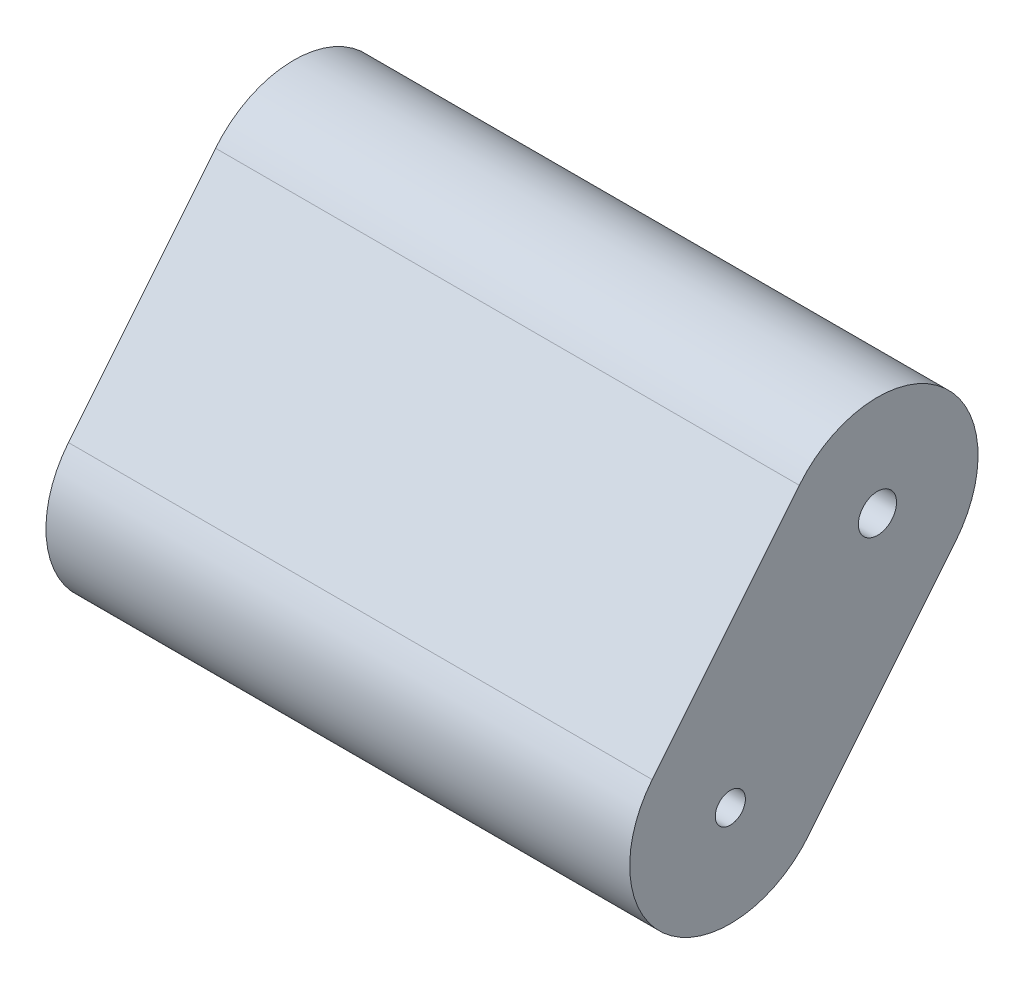
ISO-10303-21;
HEADER;
FILE_DESCRIPTION(('STEP AP214'),'2;1');
FILE_NAME('part.step','',(''),(''),'','','');
FILE_SCHEMA(('AUTOMOTIVE_DESIGN { 1 0 10303 214 1 1 1 1 }'));
ENDSEC;
DATA;
#1=APPLICATION_CONTEXT('core data for automotive mechanical design processes');
#2=APPLICATION_PROTOCOL_DEFINITION('international standard','automotive_design',2000,#1);
#3=PRODUCT_CONTEXT('',#1,'mechanical');
#4=PRODUCT('Part','Part','',(#3));
#5=PRODUCT_RELATED_PRODUCT_CATEGORY('part','',(#4));
#6=PRODUCT_DEFINITION_FORMATION('','',#4);
#7=PRODUCT_DEFINITION_CONTEXT('part definition',#1,'design');
#8=PRODUCT_DEFINITION('design','',#6,#7);
#9=PRODUCT_DEFINITION_SHAPE('','',#8);
#10=(LENGTH_UNIT() NAMED_UNIT(*) SI_UNIT(.MILLI.,.METRE.));
#11=(NAMED_UNIT(*) PLANE_ANGLE_UNIT() SI_UNIT($,.RADIAN.));
#12=(NAMED_UNIT(*) SI_UNIT($,.STERADIAN.) SOLID_ANGLE_UNIT());
#13=UNCERTAINTY_MEASURE_WITH_UNIT(LENGTH_MEASURE(1.E-05),#10,'distance_accuracy_value','');
#14=(GEOMETRIC_REPRESENTATION_CONTEXT(3) GLOBAL_UNCERTAINTY_ASSIGNED_CONTEXT((#13)) GLOBAL_UNIT_ASSIGNED_CONTEXT((#10,
#11,#12)) REPRESENTATION_CONTEXT('',''));
#15=CARTESIAN_POINT('',(0.,0.,0.));
#16=DIRECTION('',(0.,0.,1.));
#17=DIRECTION('',(1.,0.,0.));
#18=AXIS2_PLACEMENT_3D('',#15,#16,#17);
#19=CARTESIAN_POINT('',(10.,-6.4620300995487,12.3170228121561));
#20=DIRECTION('',(1.,0.,0.));
#21=DIRECTION('',(0.,0.,-1.));
#22=AXIS2_PLACEMENT_3D('',#19,#20,#21);
#23=PLANE('',#22);
#24=CARTESIAN_POINT('',(10.,-3.35582982860664,9.79680062417354));
#25=DIRECTION('',(1.,0.,0.));
#26=DIRECTION('',(0.,0.,-1.));
#27=AXIS2_PLACEMENT_3D('',#24,#25,#26);
#28=CIRCLE('',#27,0.326902338336631);
#29=CARTESIAN_POINT('',(10.,-3.35582982860664,9.46989828583691));
#30=VERTEX_POINT('',#29);
#31=EDGE_CURVE('E100',#30,#30,#28,.T.);
#32=ORIENTED_EDGE('',*,*,#31,.F.);
#33=EDGE_LOOP('',(#32));
#34=FACE_BOUND('',#33,.T.);
#35=CARTESIAN_POINT('',(10.,-6.4620300995487,12.3170228121561));
#36=DIRECTION('',(1.,0.,0.));
#37=DIRECTION('',(0.,0.,-1.));
#38=AXIS2_PLACEMENT_3D('',#35,#36,#37);
#39=CIRCLE('',#38,1.72333014926297);
#40=CARTESIAN_POINT('',(10.,-5.37623637970075,13.6552749562969));
#41=VERTEX_POINT('',#40);
#42=CARTESIAN_POINT('',(10.,-7.54782381939664,10.9787706680153));
#43=VERTEX_POINT('',#42);
#44=EDGE_CURVE('E85',#41,#43,#39,.T.);
#45=ORIENTED_EDGE('',*,*,#44,.T.);
#46=DIRECTION('',(0.,0.776550067735513,-0.630055546995636));
#47=VECTOR('',#46,1.);
#48=CARTESIAN_POINT('',(10.,-7.54782381939664,10.9787706680153));
#49=LINE('',#48,#47);
#50=CARTESIAN_POINT('',(10.,-4.44162354845459,8.45854848003273));
#51=VERTEX_POINT('',#50);
#52=EDGE_CURVE('E80',#43,#51,#49,.T.);
#53=ORIENTED_EDGE('',*,*,#52,.T.);
#54=CARTESIAN_POINT('',(10.,-3.35582982860665,9.79680062417354));
#55=DIRECTION('',(1.,0.,0.));
#56=DIRECTION('',(0.,0.,-1.));
#57=AXIS2_PLACEMENT_3D('',#54,#55,#56);
#58=CIRCLE('',#57,1.72333014926297);
#59=CARTESIAN_POINT('',(10.,-2.2700361087587,11.1350527683143));
#60=VERTEX_POINT('',#59);
#61=EDGE_CURVE('E83',#51,#60,#58,.T.);
#62=ORIENTED_EDGE('',*,*,#61,.T.);
#63=DIRECTION('',(0.,-0.776550067735513,0.630055546995636));
#64=VECTOR('',#63,1.);
#65=CARTESIAN_POINT('',(10.,-5.37623637970075,13.6552749562969));
#66=LINE('',#65,#64);
#67=EDGE_CURVE('E50',#60,#41,#66,.T.);
#68=ORIENTED_EDGE('',*,*,#67,.T.);
#69=EDGE_LOOP('',(#45,#53,#62,#68));
#70=FACE_BOUND('',#69,.T.);
#71=CARTESIAN_POINT('',(10.,-6.4620300995487,12.3170228121561));
#72=DIRECTION('',(1.,0.,0.));
#73=DIRECTION('',(0.,0.,-1.));
#74=AXIS2_PLACEMENT_3D('',#71,#72,#73);
#75=CIRCLE('',#74,0.257793045293182);
#76=CARTESIAN_POINT('',(10.,-6.4620300995487,12.0592297668629));
#77=VERTEX_POINT('',#76);
#78=EDGE_CURVE('E115',#77,#77,#75,.T.);
#79=ORIENTED_EDGE('',*,*,#78,.F.);
#80=EDGE_LOOP('',(#79));
#81=FACE_BOUND('',#80,.T.);
#82=ADVANCED_FACE('F33',(#34,#70,#81),#23,.T.);
#83=CARTESIAN_POINT('',(0.,-6.4620300995487,12.3170228121561));
#84=DIRECTION('',(1.,0.,0.));
#85=DIRECTION('',(0.,0.,-1.));
#86=AXIS2_PLACEMENT_3D('',#83,#84,#85);
#87=PLANE('',#86);
#88=CARTESIAN_POINT('',(0.,-6.4620300995487,12.3170228121561));
#89=DIRECTION('',(1.,0.,0.));
#90=DIRECTION('',(0.,0.,-1.));
#91=AXIS2_PLACEMENT_3D('',#88,#89,#90);
#92=CIRCLE('',#91,1.72333014926297);
#93=CARTESIAN_POINT('',(0.,-5.37623637970075,13.6552749562969));
#94=VERTEX_POINT('',#93);
#95=CARTESIAN_POINT('',(0.,-7.54782381939664,10.9787706680153));
#96=VERTEX_POINT('',#95);
#97=EDGE_CURVE('E97',#94,#96,#92,.T.);
#98=ORIENTED_EDGE('',*,*,#97,.F.);
#99=DIRECTION('',(0.,-0.776550067735513,0.630055546995636));
#100=VECTOR('',#99,1.);
#101=CARTESIAN_POINT('',(0.,-5.37623637970075,13.6552749562969));
#102=LINE('',#101,#100);
#103=CARTESIAN_POINT('',(0.,-2.2700361087587,11.1350527683143));
#104=VERTEX_POINT('',#103);
#105=EDGE_CURVE('E73',#104,#94,#102,.T.);
#106=ORIENTED_EDGE('',*,*,#105,.F.);
#107=CARTESIAN_POINT('',(0.,-3.35582982860665,9.79680062417354));
#108=DIRECTION('',(1.,0.,0.));
#109=DIRECTION('',(0.,0.,-1.));
#110=AXIS2_PLACEMENT_3D('',#107,#108,#109);
#111=CIRCLE('',#110,1.72333014926297);
#112=CARTESIAN_POINT('',(0.,-4.44162354845459,8.45854848003273));
#113=VERTEX_POINT('',#112);
#114=EDGE_CURVE('E67',#113,#104,#111,.T.);
#115=ORIENTED_EDGE('',*,*,#114,.F.);
#116=DIRECTION('',(0.,0.776550067735513,-0.630055546995636));
#117=VECTOR('',#116,1.);
#118=CARTESIAN_POINT('',(0.,-7.54782381939664,10.9787706680153));
#119=LINE('',#118,#117);
#120=EDGE_CURVE('E89',#96,#113,#119,.T.);
#121=ORIENTED_EDGE('',*,*,#120,.F.);
#122=EDGE_LOOP('',(#98,#106,#115,#121));
#123=FACE_BOUND('',#122,.T.);
#124=CARTESIAN_POINT('',(0.,-3.35582982860664,9.79680062417354));
#125=DIRECTION('',(1.,0.,0.));
#126=DIRECTION('',(0.,0.,-1.));
#127=AXIS2_PLACEMENT_3D('',#124,#125,#126);
#128=CIRCLE('',#127,0.326902338336631);
#129=CARTESIAN_POINT('',(0.,-3.35582982860664,9.46989828583691));
#130=VERTEX_POINT('',#129);
#131=EDGE_CURVE('E112',#130,#130,#128,.T.);
#132=ORIENTED_EDGE('',*,*,#131,.T.);
#133=EDGE_LOOP('',(#132));
#134=FACE_BOUND('',#133,.T.);
#135=CARTESIAN_POINT('',(0.,-6.4620300995487,12.3170228121561));
#136=DIRECTION('',(1.,0.,0.));
#137=DIRECTION('',(0.,0.,-1.));
#138=AXIS2_PLACEMENT_3D('',#135,#136,#137);
#139=CIRCLE('',#138,0.257793045293182);
#140=CARTESIAN_POINT('',(0.,-6.4620300995487,12.0592297668629));
#141=VERTEX_POINT('',#140);
#142=EDGE_CURVE('E118',#141,#141,#139,.T.);
#143=ORIENTED_EDGE('',*,*,#142,.T.);
#144=EDGE_LOOP('',(#143));
#145=FACE_BOUND('',#144,.T.);
#146=ADVANCED_FACE('F108',(#123,#134,#145),#87,.F.);
#147=CARTESIAN_POINT('',(10.,-6.4620300995487,12.3170228121561));
#148=DIRECTION('',(-1.,0.,0.));
#149=DIRECTION('',(0.,0.,1.));
#150=AXIS2_PLACEMENT_3D('',#147,#148,#149);
#151=CYLINDRICAL_SURFACE('',#150,1.72333014926297);
#152=ORIENTED_EDGE('',*,*,#97,.T.);
#153=DIRECTION('',(-1.,0.,0.));
#154=VECTOR('',#153,1.);
#155=CARTESIAN_POINT('',(10.,-7.54782381939664,10.9787706680153));
#156=LINE('',#155,#154);
#157=EDGE_CURVE('E11',#43,#96,#156,.T.);
#158=ORIENTED_EDGE('',*,*,#157,.F.);
#159=ORIENTED_EDGE('',*,*,#44,.F.);
#160=DIRECTION('',(-1.,0.,0.));
#161=VECTOR('',#160,1.);
#162=CARTESIAN_POINT('',(10.,-5.37623637970075,13.6552749562969));
#163=LINE('',#162,#161);
#164=EDGE_CURVE('E93',#41,#94,#163,.T.);
#165=ORIENTED_EDGE('',*,*,#164,.T.);
#166=EDGE_LOOP('',(#152,#158,#159,#165));
#167=FACE_BOUND('',#166,.T.);
#168=ADVANCED_FACE('F35',(#167),#151,.T.);
#169=CARTESIAN_POINT('',(10.,-7.54782381939664,10.9787706680153));
#170=DIRECTION('',(0.,0.630055546995636,0.776550067735513));
#171=DIRECTION('',(0.,-0.776550067735513,0.630055546995636));
#172=AXIS2_PLACEMENT_3D('',#169,#170,#171);
#173=PLANE('',#172);
#174=ORIENTED_EDGE('',*,*,#120,.T.);
#175=DIRECTION('',(-1.,0.,0.));
#176=VECTOR('',#175,1.);
#177=CARTESIAN_POINT('',(10.,-4.44162354845459,8.45854848003273));
#178=LINE('',#177,#176);
#179=EDGE_CURVE('E42',#51,#113,#178,.T.);
#180=ORIENTED_EDGE('',*,*,#179,.F.);
#181=ORIENTED_EDGE('',*,*,#52,.F.);
#182=ORIENTED_EDGE('',*,*,#157,.T.);
#183=EDGE_LOOP('',(#174,#180,#181,#182));
#184=FACE_BOUND('',#183,.T.);
#185=ADVANCED_FACE('F88',(#184),#173,.F.);
#186=CARTESIAN_POINT('',(10.,-3.35582982860665,9.79680062417354));
#187=DIRECTION('',(-1.,0.,0.));
#188=DIRECTION('',(0.,0.,1.));
#189=AXIS2_PLACEMENT_3D('',#186,#187,#188);
#190=CYLINDRICAL_SURFACE('',#189,1.72333014926297);
#191=ORIENTED_EDGE('',*,*,#114,.T.);
#192=DIRECTION('',(-1.,0.,0.));
#193=VECTOR('',#192,1.);
#194=CARTESIAN_POINT('',(10.,-2.2700361087587,11.1350527683143));
#195=LINE('',#194,#193);
#196=EDGE_CURVE('E90',#60,#104,#195,.T.);
#197=ORIENTED_EDGE('',*,*,#196,.F.);
#198=ORIENTED_EDGE('',*,*,#61,.F.);
#199=ORIENTED_EDGE('',*,*,#179,.T.);
#200=EDGE_LOOP('',(#191,#197,#198,#199));
#201=FACE_BOUND('',#200,.T.);
#202=ADVANCED_FACE('F91',(#201),#190,.T.);
#203=CARTESIAN_POINT('',(10.,-5.37623637970075,13.6552749562969));
#204=DIRECTION('',(0.,-0.630055546995636,-0.776550067735513));
#205=DIRECTION('',(0.,0.776550067735513,-0.630055546995636));
#206=AXIS2_PLACEMENT_3D('',#203,#204,#205);
#207=PLANE('',#206);
#208=ORIENTED_EDGE('',*,*,#105,.T.);
#209=ORIENTED_EDGE('',*,*,#164,.F.);
#210=ORIENTED_EDGE('',*,*,#67,.F.);
#211=ORIENTED_EDGE('',*,*,#196,.T.);
#212=EDGE_LOOP('',(#208,#209,#210,#211));
#213=FACE_BOUND('',#212,.T.);
#214=ADVANCED_FACE('F105',(#213),#207,.F.);
#215=CARTESIAN_POINT('',(10.,-3.35582982860664,9.79680062417354));
#216=DIRECTION('',(-1.,0.,0.));
#217=DIRECTION('',(0.,0.,1.));
#218=AXIS2_PLACEMENT_3D('',#215,#216,#217);
#219=CYLINDRICAL_SURFACE('',#218,0.326902338336631);
#220=ORIENTED_EDGE('',*,*,#31,.T.);
#221=EDGE_LOOP('',(#220));
#222=FACE_BOUND('',#221,.T.);
#223=ORIENTED_EDGE('',*,*,#131,.F.);
#224=EDGE_LOOP('',(#223));
#225=FACE_BOUND('',#224,.T.);
#226=ADVANCED_FACE('F135',(#222,#225),#219,.F.);
#227=CARTESIAN_POINT('',(10.,-6.4620300995487,12.3170228121561));
#228=DIRECTION('',(-1.,0.,0.));
#229=DIRECTION('',(0.,0.,1.));
#230=AXIS2_PLACEMENT_3D('',#227,#228,#229);
#231=CYLINDRICAL_SURFACE('',#230,0.257793045293182);
#232=ORIENTED_EDGE('',*,*,#78,.T.);
#233=EDGE_LOOP('',(#232));
#234=FACE_BOUND('',#233,.T.);
#235=ORIENTED_EDGE('',*,*,#142,.F.);
#236=EDGE_LOOP('',(#235));
#237=FACE_BOUND('',#236,.T.);
#238=ADVANCED_FACE('F124',(#234,#237),#231,.F.);
#239=CLOSED_SHELL('',(#82,#146,#168,#185,#202,#214,#226,#238));
#240=MANIFOLD_SOLID_BREP('B2',#239);
#241=ADVANCED_BREP_SHAPE_REPRESENTATION('',(#18,#240),#14);
#242=SHAPE_DEFINITION_REPRESENTATION(#9,#241);
ENDSEC;
END-ISO-10303-21;
